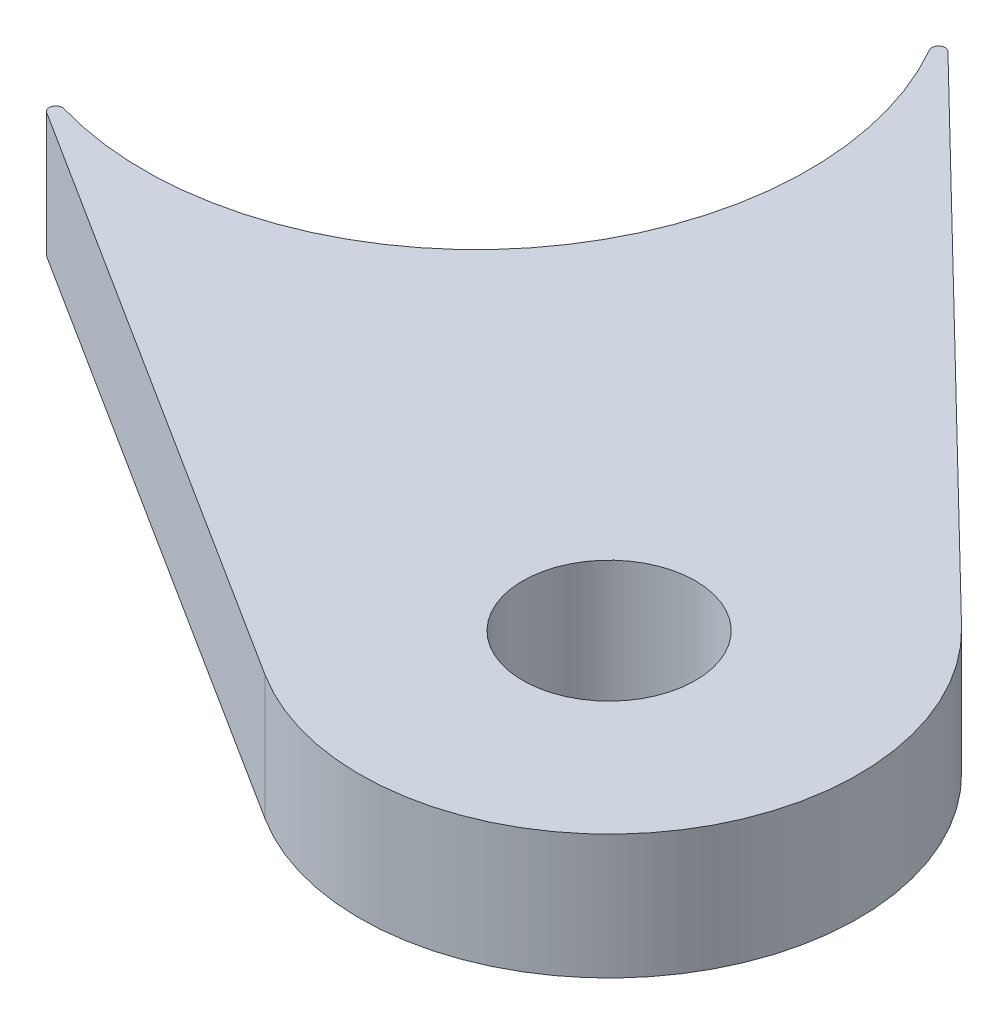
ISO-10303-21;
HEADER;
FILE_DESCRIPTION(('STEP AP214'),'2;1');
FILE_NAME('part.step','',(''),(''),'','','');
FILE_SCHEMA(('AUTOMOTIVE_DESIGN { 1 0 10303 214 1 1 1 1 }'));
ENDSEC;
DATA;
#1=APPLICATION_CONTEXT('core data for automotive mechanical design processes');
#2=APPLICATION_PROTOCOL_DEFINITION('international standard','automotive_design',2000,#1);
#3=PRODUCT_CONTEXT('',#1,'mechanical');
#4=PRODUCT('Part','Part','',(#3));
#5=PRODUCT_RELATED_PRODUCT_CATEGORY('part','',(#4));
#6=PRODUCT_DEFINITION_FORMATION('','',#4);
#7=PRODUCT_DEFINITION_CONTEXT('part definition',#1,'design');
#8=PRODUCT_DEFINITION('design','',#6,#7);
#9=PRODUCT_DEFINITION_SHAPE('','',#8);
#10=(LENGTH_UNIT() NAMED_UNIT(*) SI_UNIT(.MILLI.,.METRE.));
#11=(NAMED_UNIT(*) PLANE_ANGLE_UNIT() SI_UNIT($,.RADIAN.));
#12=(NAMED_UNIT(*) SI_UNIT($,.STERADIAN.) SOLID_ANGLE_UNIT());
#13=UNCERTAINTY_MEASURE_WITH_UNIT(LENGTH_MEASURE(1.E-05),#10,'distance_accuracy_value','');
#14=(GEOMETRIC_REPRESENTATION_CONTEXT(3) GLOBAL_UNCERTAINTY_ASSIGNED_CONTEXT((#13)) GLOBAL_UNIT_ASSIGNED_CONTEXT((#10,
#11,#12)) REPRESENTATION_CONTEXT('',''));
#15=CARTESIAN_POINT('',(0.,0.,0.));
#16=DIRECTION('',(0.,0.,1.));
#17=DIRECTION('',(1.,0.,0.));
#18=AXIS2_PLACEMENT_3D('',#15,#16,#17);
#19=CARTESIAN_POINT('',(13.6525,4.7625,11.1125));
#20=DIRECTION('',(0.,-1.,0.));
#21=DIRECTION('',(0.,0.,-1.));
#22=AXIS2_PLACEMENT_3D('',#19,#20,#21);
#23=PLANE('',#22);
#24=CARTESIAN_POINT('',(-10.4775,4.7625,-7.93750000000015));
#25=DIRECTION('',(0.,-1.,0.));
#26=DIRECTION('',(0.,0.,1.));
#27=AXIS2_PLACEMENT_3D('',#24,#25,#26);
#28=CIRCLE('',#27,12.7);
#29=CARTESIAN_POINT('',(0.555968423000543,4.7625,-14.2265837614593));
#30=VERTEX_POINT('',#29);
#31=CARTESIAN_POINT('',(-14.0341997244091,4.7625,4.25429589192604));
#32=VERTEX_POINT('',#31);
#33=EDGE_CURVE('E97',#30,#32,#28,.T.);
#34=ORIENTED_EDGE('',*,*,#33,.T.);
#35=CARTESIAN_POINT('',(-14.1053337188973,4.7625,4.49813180976456));
#36=DIRECTION('',(0.,-1.,0.));
#37=DIRECTION('',(0.,0.,-1.));
#38=AXIS2_PLACEMENT_3D('',#35,#36,#37);
#39=CIRCLE('',#38,0.254);
#40=CARTESIAN_POINT('',(-14.241293059092,4.7625,4.71268030734453));
#41=VERTEX_POINT('',#40);
#42=EDGE_CURVE('E45',#32,#41,#39,.F.);
#43=ORIENTED_EDGE('',*,*,#42,.T.);
#44=DIRECTION('',(0.84467912433056,0.,0.535272992892559));
#45=VECTOR('',#44,1.);
#46=CARTESIAN_POINT('',(8.55402474269826,4.7625,19.1580686592487));
#47=LINE('',#46,#45);
#48=CARTESIAN_POINT('',(8.55402474269826,4.7625,19.1580686592487));
#49=VERTEX_POINT('',#48);
#50=EDGE_CURVE('E103',#41,#49,#47,.T.);
#51=ORIENTED_EDGE('',*,*,#50,.T.);
#52=CARTESIAN_POINT('',(13.6525,4.7625,11.1125));
#53=DIRECTION('',(0.,1.,0.));
#54=DIRECTION('',(0.,0.,-1.));
#55=AXIS2_PLACEMENT_3D('',#52,#53,#54);
#56=CIRCLE('',#55,9.52500000000013);
#57=CARTESIAN_POINT('',(20.295130547404,4.7625,4.2860013066216));
#58=VERTEX_POINT('',#57);
#59=EDGE_CURVE('E98',#49,#58,#56,.T.);
#60=ORIENTED_EDGE('',*,*,#59,.T.);
#61=DIRECTION('',(-0.716692776207698,0.,-0.697389033848183));
#62=VECTOR('',#61,1.);
#63=CARTESIAN_POINT('',(20.295130547404,4.7625,4.2860013066216));
#64=LINE('',#63,#62);
#65=CARTESIAN_POINT('',(0.953774606057993,4.7625,-14.5344054018452));
#66=VERTEX_POINT('',#65);
#67=EDGE_CURVE('E89',#58,#66,#64,.T.);
#68=ORIENTED_EDGE('',*,*,#67,.T.);
#69=CARTESIAN_POINT('',(0.776637791460556,4.7625,-14.3523654366885));
#70=DIRECTION('',(0.,-1.,0.));
#71=DIRECTION('',(0.,0.,-1.));
#72=AXIS2_PLACEMENT_3D('',#69,#70,#71);
#73=CIRCLE('',#72,0.254);
#74=EDGE_CURVE('E128',#66,#30,#73,.F.);
#75=ORIENTED_EDGE('',*,*,#74,.T.);
#76=EDGE_LOOP('',(#34,#43,#51,#60,#68,#75));
#77=FACE_BOUND('',#76,.T.);
#78=CARTESIAN_POINT('',(13.6525,4.7625,11.1125));
#79=DIRECTION('',(0.,1.,0.));
#80=DIRECTION('',(0.,0.,1.));
#81=AXIS2_PLACEMENT_3D('',#78,#79,#80);
#82=CIRCLE('',#81,3.29999999999998);
#83=CARTESIAN_POINT('',(13.6525,4.7625,7.81250000000005));
#84=VERTEX_POINT('',#83);
#85=EDGE_CURVE('E148',#84,#84,#82,.T.);
#86=ORIENTED_EDGE('',*,*,#85,.F.);
#87=EDGE_LOOP('',(#86));
#88=FACE_BOUND('',#87,.T.);
#89=ADVANCED_FACE('F37',(#77,#88),#23,.F.);
#90=CARTESIAN_POINT('',(13.6525,0.,11.1125));
#91=DIRECTION('',(0.,-1.,0.));
#92=DIRECTION('',(0.,0.,-1.));
#93=AXIS2_PLACEMENT_3D('',#90,#91,#92);
#94=PLANE('',#93);
#95=DIRECTION('',(0.84467912433056,0.,0.535272992892559));
#96=VECTOR('',#95,1.);
#97=CARTESIAN_POINT('',(8.55402474269826,0.,19.1580686592487));
#98=LINE('',#97,#96);
#99=CARTESIAN_POINT('',(-14.241293059092,0.,4.71268030734453));
#100=VERTEX_POINT('',#99);
#101=CARTESIAN_POINT('',(8.55402474269826,0.,19.1580686592487));
#102=VERTEX_POINT('',#101);
#103=EDGE_CURVE('E107',#100,#102,#98,.T.);
#104=ORIENTED_EDGE('',*,*,#103,.F.);
#105=CARTESIAN_POINT('',(-14.1053337188973,0.,4.49813180976456));
#106=DIRECTION('',(0.,-1.,0.));
#107=DIRECTION('',(0.,0.,-1.));
#108=AXIS2_PLACEMENT_3D('',#105,#106,#107);
#109=CIRCLE('',#108,0.254);
#110=CARTESIAN_POINT('',(-14.0341997244091,0.,4.25429589192604));
#111=VERTEX_POINT('',#110);
#112=EDGE_CURVE('E122',#100,#111,#109,.T.);
#113=ORIENTED_EDGE('',*,*,#112,.T.);
#114=CARTESIAN_POINT('',(-10.4775,0.,-7.93750000000015));
#115=DIRECTION('',(0.,-1.,0.));
#116=DIRECTION('',(0.,0.,1.));
#117=AXIS2_PLACEMENT_3D('',#114,#115,#116);
#118=CIRCLE('',#117,12.7);
#119=CARTESIAN_POINT('',(0.555968423000543,0.,-14.2265837614593));
#120=VERTEX_POINT('',#119);
#121=EDGE_CURVE('E141',#120,#111,#118,.T.);
#122=ORIENTED_EDGE('',*,*,#121,.F.);
#123=CARTESIAN_POINT('',(0.776637791460556,0.,-14.3523654366885));
#124=DIRECTION('',(0.,-1.,0.));
#125=DIRECTION('',(0.,0.,-1.));
#126=AXIS2_PLACEMENT_3D('',#123,#124,#125);
#127=CIRCLE('',#126,0.254);
#128=CARTESIAN_POINT('',(0.953774606057993,0.,-14.5344054018452));
#129=VERTEX_POINT('',#128);
#130=EDGE_CURVE('E116',#120,#129,#127,.T.);
#131=ORIENTED_EDGE('',*,*,#130,.T.);
#132=DIRECTION('',(-0.716692776207698,0.,-0.697389033848183));
#133=VECTOR('',#132,1.);
#134=CARTESIAN_POINT('',(20.295130547404,0.,4.2860013066216));
#135=LINE('',#134,#133);
#136=CARTESIAN_POINT('',(20.295130547404,0.,4.2860013066216));
#137=VERTEX_POINT('',#136);
#138=EDGE_CURVE('E144',#137,#129,#135,.T.);
#139=ORIENTED_EDGE('',*,*,#138,.F.);
#140=CARTESIAN_POINT('',(13.6525,0.,11.1125));
#141=DIRECTION('',(0.,1.,0.));
#142=DIRECTION('',(0.,0.,-1.));
#143=AXIS2_PLACEMENT_3D('',#140,#141,#142);
#144=CIRCLE('',#143,9.52500000000013);
#145=EDGE_CURVE('E111',#102,#137,#144,.T.);
#146=ORIENTED_EDGE('',*,*,#145,.F.);
#147=EDGE_LOOP('',(#104,#113,#122,#131,#139,#146));
#148=FACE_BOUND('',#147,.T.);
#149=CARTESIAN_POINT('',(13.6525,0.,11.1125));
#150=DIRECTION('',(0.,1.,0.));
#151=DIRECTION('',(0.,0.,1.));
#152=AXIS2_PLACEMENT_3D('',#149,#150,#151);
#153=CIRCLE('',#152,3.29999999999998);
#154=CARTESIAN_POINT('',(13.6525,0.,7.81250000000005));
#155=VERTEX_POINT('',#154);
#156=EDGE_CURVE('E151',#155,#155,#153,.T.);
#157=ORIENTED_EDGE('',*,*,#156,.T.);
#158=EDGE_LOOP('',(#157));
#159=FACE_BOUND('',#158,.T.);
#160=ADVANCED_FACE('F139',(#148,#159),#94,.T.);
#161=CARTESIAN_POINT('',(13.6525,4.7625,11.1125));
#162=DIRECTION('',(0.,-1.,0.));
#163=DIRECTION('',(0.,0.,-1.));
#164=AXIS2_PLACEMENT_3D('',#161,#162,#163);
#165=CYLINDRICAL_SURFACE('',#164,9.52500000000013);
#166=ORIENTED_EDGE('',*,*,#145,.T.);
#167=DIRECTION('',(0.,-1.,0.));
#168=VECTOR('',#167,1.);
#169=CARTESIAN_POINT('',(20.295130547404,4.7625,4.2860013066216));
#170=LINE('',#169,#168);
#171=EDGE_CURVE('E93',#58,#137,#170,.T.);
#172=ORIENTED_EDGE('',*,*,#171,.F.);
#173=ORIENTED_EDGE('',*,*,#59,.F.);
#174=DIRECTION('',(0.,-1.,0.));
#175=VECTOR('',#174,1.);
#176=CARTESIAN_POINT('',(8.55402474269826,4.7625,19.1580686592487));
#177=LINE('',#176,#175);
#178=EDGE_CURVE('E113',#49,#102,#177,.T.);
#179=ORIENTED_EDGE('',*,*,#178,.T.);
#180=EDGE_LOOP('',(#166,#172,#173,#179));
#181=FACE_BOUND('',#180,.T.);
#182=ADVANCED_FACE('F109',(#181),#165,.T.);
#183=CARTESIAN_POINT('',(20.295130547404,4.7625,4.2860013066216));
#184=DIRECTION('',(-0.697389033848183,0.,0.716692776207698));
#185=DIRECTION('',(0.716692776207699,0.,0.697389033848183));
#186=AXIS2_PLACEMENT_3D('',#183,#184,#185);
#187=PLANE('',#186);
#188=ORIENTED_EDGE('',*,*,#138,.T.);
#189=DIRECTION('',(0.,-1.,0.));
#190=VECTOR('',#189,1.);
#191=CARTESIAN_POINT('',(0.953774606057996,4.7625,-14.5344054018452));
#192=LINE('',#191,#190);
#193=EDGE_CURVE('E11',#129,#66,#192,.F.);
#194=ORIENTED_EDGE('',*,*,#193,.T.);
#195=ORIENTED_EDGE('',*,*,#67,.F.);
#196=ORIENTED_EDGE('',*,*,#171,.T.);
#197=EDGE_LOOP('',(#188,#194,#195,#196));
#198=FACE_BOUND('',#197,.T.);
#199=ADVANCED_FACE('F91',(#198),#187,.F.);
#200=CARTESIAN_POINT('',(-10.4775,4.7625,-7.93750000000015));
#201=DIRECTION('',(0.,-1.,0.));
#202=DIRECTION('',(0.,0.,-1.));
#203=AXIS2_PLACEMENT_3D('',#200,#201,#202);
#204=CYLINDRICAL_SURFACE('',#203,12.7);
#205=ORIENTED_EDGE('',*,*,#121,.T.);
#206=DIRECTION('',(0.,-1.,0.));
#207=VECTOR('',#206,1.);
#208=CARTESIAN_POINT('',(-14.0341997244091,4.7625,4.25429589192604));
#209=LINE('',#208,#207);
#210=EDGE_CURVE('E58',#111,#32,#209,.F.);
#211=ORIENTED_EDGE('',*,*,#210,.T.);
#212=ORIENTED_EDGE('',*,*,#33,.F.);
#213=DIRECTION('',(0.,-1.,0.));
#214=VECTOR('',#213,1.);
#215=CARTESIAN_POINT('',(0.555968423000541,4.7625,-14.2265837614593));
#216=LINE('',#215,#214);
#217=EDGE_CURVE('E124',#30,#120,#216,.T.);
#218=ORIENTED_EDGE('',*,*,#217,.T.);
#219=EDGE_LOOP('',(#205,#211,#212,#218));
#220=FACE_BOUND('',#219,.T.);
#221=ADVANCED_FACE('F142',(#220),#204,.F.);
#222=CARTESIAN_POINT('',(8.55402474269826,4.7625,19.1580686592487));
#223=DIRECTION('',(0.53527299289256,0.,-0.84467912433056));
#224=DIRECTION('',(-0.84467912433056,0.,-0.53527299289256));
#225=AXIS2_PLACEMENT_3D('',#222,#223,#224);
#226=PLANE('',#225);
#227=ORIENTED_EDGE('',*,*,#50,.F.);
#228=DIRECTION('',(0.,-1.,0.));
#229=VECTOR('',#228,1.);
#230=CARTESIAN_POINT('',(-14.241293059092,4.7625,4.71268030734453));
#231=LINE('',#230,#229);
#232=EDGE_CURVE('E112',#41,#100,#231,.T.);
#233=ORIENTED_EDGE('',*,*,#232,.T.);
#234=ORIENTED_EDGE('',*,*,#103,.T.);
#235=ORIENTED_EDGE('',*,*,#178,.F.);
#236=EDGE_LOOP('',(#227,#233,#234,#235));
#237=FACE_BOUND('',#236,.T.);
#238=ADVANCED_FACE('F133',(#237),#226,.F.);
#239=CARTESIAN_POINT('',(13.6525,4.7625,11.1125));
#240=DIRECTION('',(0.,-1.,0.));
#241=DIRECTION('',(0.,0.,-1.));
#242=AXIS2_PLACEMENT_3D('',#239,#240,#241);
#243=CYLINDRICAL_SURFACE('',#242,3.29999999999998);
#244=CARTESIAN_POINT('',(13.6525,4.7625,7.81250000000005));
#245=CARTESIAN_POINT('',(13.6525,4.712890625,7.81250000000005));
#246=CARTESIAN_POINT('',(13.6525,4.66328125,7.81250000000005));
#247=CARTESIAN_POINT('',(13.6525,4.5640625,7.81250000000005));
#248=CARTESIAN_POINT('',(13.6525,4.514453125,7.81250000000005));
#249=CARTESIAN_POINT('',(13.6525,4.415234375,7.81250000000005));
#250=CARTESIAN_POINT('',(13.6525,4.365625,7.81250000000005));
#251=CARTESIAN_POINT('',(13.6525,4.26640625,7.81250000000005));
#252=CARTESIAN_POINT('',(13.6525,4.216796875,7.81250000000005));
#253=CARTESIAN_POINT('',(13.6525,4.117578125,7.81250000000005));
#254=CARTESIAN_POINT('',(13.6525,4.06796875,7.81250000000005));
#255=CARTESIAN_POINT('',(13.6525,3.96875,7.81250000000005));
#256=CARTESIAN_POINT('',(13.6525,3.919140625,7.81250000000005));
#257=CARTESIAN_POINT('',(13.6525,3.819921875,7.81250000000005));
#258=CARTESIAN_POINT('',(13.6525,3.7703125,7.81250000000005));
#259=CARTESIAN_POINT('',(13.6525,3.67109375,7.81250000000005));
#260=CARTESIAN_POINT('',(13.6525,3.621484375,7.81250000000005));
#261=CARTESIAN_POINT('',(13.6525,3.522265625,7.81250000000005));
#262=CARTESIAN_POINT('',(13.6525,3.47265625,7.81250000000005));
#263=CARTESIAN_POINT('',(13.6525,3.3734375,7.81250000000005));
#264=CARTESIAN_POINT('',(13.6525,3.323828125,7.81250000000005));
#265=CARTESIAN_POINT('',(13.6525,3.224609375,7.81250000000005));
#266=CARTESIAN_POINT('',(13.6525,3.175,7.81250000000005));
#267=CARTESIAN_POINT('',(13.6525,3.07578125,7.81250000000005));
#268=CARTESIAN_POINT('',(13.6525,3.026171875,7.81250000000005));
#269=CARTESIAN_POINT('',(13.6525,2.926953125,7.81250000000005));
#270=CARTESIAN_POINT('',(13.6525,2.87734375,7.81250000000005));
#271=CARTESIAN_POINT('',(13.6525,2.778125,7.81250000000005));
#272=CARTESIAN_POINT('',(13.6525,2.728515625,7.81250000000005));
#273=CARTESIAN_POINT('',(13.6525,2.629296875,7.81250000000005));
#274=CARTESIAN_POINT('',(13.6525,2.5796875,7.81250000000005));
#275=CARTESIAN_POINT('',(13.6525,2.48046875,7.81250000000005));
#276=CARTESIAN_POINT('',(13.6525,2.430859375,7.81250000000005));
#277=CARTESIAN_POINT('',(13.6525,2.331640625,7.81250000000005));
#278=CARTESIAN_POINT('',(13.6525,2.28203125,7.81250000000005));
#279=CARTESIAN_POINT('',(13.6525,2.1828125,7.81250000000005));
#280=CARTESIAN_POINT('',(13.6525,2.133203125,7.81250000000005));
#281=CARTESIAN_POINT('',(13.6525,2.033984375,7.81250000000005));
#282=CARTESIAN_POINT('',(13.6525,1.984375,7.81250000000005));
#283=CARTESIAN_POINT('',(13.6525,1.88515625,7.81250000000005));
#284=CARTESIAN_POINT('',(13.6525,1.835546875,7.81250000000005));
#285=CARTESIAN_POINT('',(13.6525,1.736328125,7.81250000000005));
#286=CARTESIAN_POINT('',(13.6525,1.68671875,7.81250000000005));
#287=CARTESIAN_POINT('',(13.6525,1.5875,7.81250000000005));
#288=CARTESIAN_POINT('',(13.6525,1.537890625,7.81250000000005));
#289=CARTESIAN_POINT('',(13.6525,1.438671875,7.81250000000005));
#290=CARTESIAN_POINT('',(13.6525,1.3890625,7.81250000000005));
#291=CARTESIAN_POINT('',(13.6525,1.28984375,7.81250000000005));
#292=CARTESIAN_POINT('',(13.6525,1.240234375,7.81250000000005));
#293=CARTESIAN_POINT('',(13.6525,1.141015625,7.81250000000005));
#294=CARTESIAN_POINT('',(13.6525,1.09140625,7.81250000000005));
#295=CARTESIAN_POINT('',(13.6525,0.992187499999999,7.81250000000005));
#296=CARTESIAN_POINT('',(13.6525,0.942578124999999,7.81250000000005));
#297=CARTESIAN_POINT('',(13.6525,0.843359375,7.81250000000005));
#298=CARTESIAN_POINT('',(13.6525,0.79375,7.81250000000005));
#299=CARTESIAN_POINT('',(13.6525,0.69453125,7.81250000000005));
#300=CARTESIAN_POINT('',(13.6525,0.644921875,7.81250000000005));
#301=CARTESIAN_POINT('',(13.6525,0.545703125,7.81250000000005));
#302=CARTESIAN_POINT('',(13.6525,0.49609375,7.81250000000005));
#303=CARTESIAN_POINT('',(13.6525,0.396875,7.81250000000005));
#304=CARTESIAN_POINT('',(13.6525,0.347265625,7.81250000000005));
#305=CARTESIAN_POINT('',(13.6525,0.248046875,7.81250000000005));
#306=CARTESIAN_POINT('',(13.6525,0.1984375,7.81250000000005));
#307=CARTESIAN_POINT('',(13.6525,0.09921875,7.81250000000005));
#308=CARTESIAN_POINT('',(13.6525,0.049609375,7.81250000000005));
#309=CARTESIAN_POINT('',(13.6525,0.,7.81250000000005));
#310=B_SPLINE_CURVE_WITH_KNOTS('',3,(#244,#245,#246,#247,#248,#249,#250,#251,#252,#253,#254,
#255,#256,#257,#258,#259,#260,#261,#262,#263,#264,#265,#266,#267,#268,#269,#270,#271,#272,#273,
#274,#275,#276,#277,#278,#279,#280,#281,#282,#283,#284,#285,#286,#287,#288,#289,#290,#291,#292,
#293,#294,#295,#296,#297,#298,#299,#300,#301,#302,#303,#304,#305,#306,#307,#308,#309),
.UNSPECIFIED.,.F.,.F.,(4,2,2,2,2,2,2,2,2,2,2,2,2,2,2,2,2,2,2,2,2,2,2,2,2,2,2,2,2,2,2,2,4),(0.,
0.148828125,0.29765625,0.446484375,0.5953125,0.744140625,0.892968750000001,1.041796875,1.190625,
1.339453125,1.48828125,1.637109375,1.7859375,1.934765625,2.08359375,2.232421875,2.38125,
2.530078125,2.67890625,2.827734375,2.9765625,3.125390625,3.27421875,3.423046875,3.571875,
3.720703125,3.86953125,4.018359375,4.1671875,4.316015625,4.46484375,4.613671875,4.7625),.UNSPECIFIED.);
#311=EDGE_CURVE('BSEAM157',#84,#155,#310,.T.);
#312=ORIENTED_EDGE('',*,*,#85,.T.);
#313=ORIENTED_EDGE('',*,*,#156,.F.);
#314=ORIENTED_EDGE('',*,*,#311,.T.);
#315=ORIENTED_EDGE('',*,*,#311,.F.);
#316=EDGE_LOOP('',(#312,#314,#313,#315));
#317=FACE_BOUND('',#316,.T.);
#318=ADVANCED_FACE('F157',(#317),#243,.F.);
#319=CARTESIAN_POINT('',(-14.1053337188973,4.7625,4.49813180976456));
#320=DIRECTION('',(0.,-1.,0.));
#321=DIRECTION('',(0.,0.,-1.));
#322=AXIS2_PLACEMENT_3D('',#319,#320,#321);
#323=CYLINDRICAL_SURFACE('',#322,0.254);
#324=ORIENTED_EDGE('',*,*,#42,.F.);
#325=ORIENTED_EDGE('',*,*,#210,.F.);
#326=ORIENTED_EDGE('',*,*,#112,.F.);
#327=ORIENTED_EDGE('',*,*,#232,.F.);
#328=EDGE_LOOP('',(#324,#325,#326,#327));
#329=FACE_BOUND('',#328,.T.);
#330=ADVANCED_FACE('F136',(#329),#323,.T.);
#331=CARTESIAN_POINT('',(0.776637791460556,4.7625,-14.3523654366885));
#332=DIRECTION('',(0.,-1.,0.));
#333=DIRECTION('',(0.,0.,-1.));
#334=AXIS2_PLACEMENT_3D('',#331,#332,#333);
#335=CYLINDRICAL_SURFACE('',#334,0.254);
#336=ORIENTED_EDGE('',*,*,#74,.F.);
#337=ORIENTED_EDGE('',*,*,#193,.F.);
#338=ORIENTED_EDGE('',*,*,#130,.F.);
#339=ORIENTED_EDGE('',*,*,#217,.F.);
#340=EDGE_LOOP('',(#336,#337,#338,#339));
#341=FACE_BOUND('',#340,.T.);
#342=ADVANCED_FACE('F39',(#341),#335,.T.);
#343=CLOSED_SHELL('',(#89,#160,#182,#199,#221,#238,#318,#330,#342));
#344=MANIFOLD_SOLID_BREP('B2',#343);
#345=ADVANCED_BREP_SHAPE_REPRESENTATION('',(#18,#344),#14);
#346=SHAPE_DEFINITION_REPRESENTATION(#9,#345);
ENDSEC;
END-ISO-10303-21;
